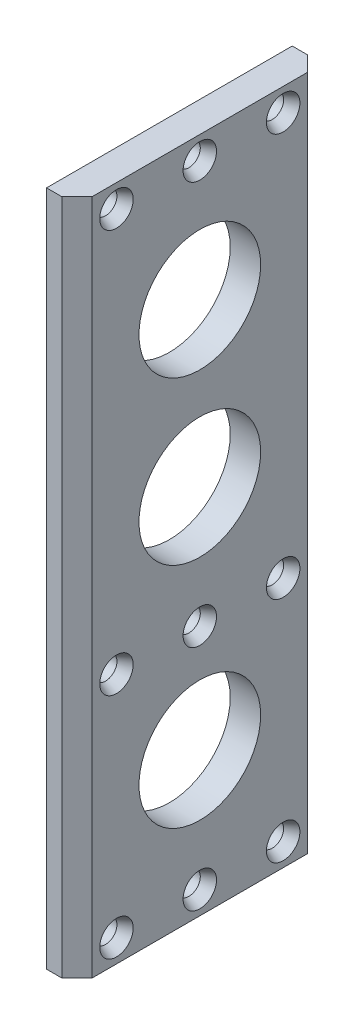
ISO-10303-21;
HEADER;
FILE_DESCRIPTION(('STEP AP214'),'2;1');
FILE_NAME('part.step','',(''),(''),'','','');
FILE_SCHEMA(('AUTOMOTIVE_DESIGN { 1 0 10303 214 1 1 1 1 }'));
ENDSEC;
DATA;
#1=APPLICATION_CONTEXT('core data for automotive mechanical design processes');
#2=APPLICATION_PROTOCOL_DEFINITION('international standard','automotive_design',2000,#1);
#3=PRODUCT_CONTEXT('',#1,'mechanical');
#4=PRODUCT('Part','Part','',(#3));
#5=PRODUCT_RELATED_PRODUCT_CATEGORY('part','',(#4));
#6=PRODUCT_DEFINITION_FORMATION('','',#4);
#7=PRODUCT_DEFINITION_CONTEXT('part definition',#1,'design');
#8=PRODUCT_DEFINITION('design','',#6,#7);
#9=PRODUCT_DEFINITION_SHAPE('','',#8);
#10=(LENGTH_UNIT() NAMED_UNIT(*) SI_UNIT(.MILLI.,.METRE.));
#11=(NAMED_UNIT(*) PLANE_ANGLE_UNIT() SI_UNIT($,.RADIAN.));
#12=(NAMED_UNIT(*) SI_UNIT($,.STERADIAN.) SOLID_ANGLE_UNIT());
#13=UNCERTAINTY_MEASURE_WITH_UNIT(LENGTH_MEASURE(1.E-05),#10,'distance_accuracy_value','');
#14=(GEOMETRIC_REPRESENTATION_CONTEXT(3) GLOBAL_UNCERTAINTY_ASSIGNED_CONTEXT((#13)) GLOBAL_UNIT_ASSIGNED_CONTEXT((#10,
#11,#12)) REPRESENTATION_CONTEXT('',''));
#15=CARTESIAN_POINT('',(0.,0.,0.));
#16=DIRECTION('',(0.,0.,1.));
#17=DIRECTION('',(1.,0.,0.));
#18=AXIS2_PLACEMENT_3D('',#15,#16,#17);
#19=CARTESIAN_POINT('',(4.,0.,-0.0251875597353166));
#20=DIRECTION('',(0.,0.,-1.));
#21=DIRECTION('',(-1.,0.,0.));
#22=AXIS2_PLACEMENT_3D('',#19,#20,#21);
#23=PLANE('',#22);
#24=DIRECTION('',(-1.,0.,0.));
#25=VECTOR('',#24,1.);
#26=CARTESIAN_POINT('',(4.,-89.,-0.0251875597353166));
#27=LINE('',#26,#25);
#28=CARTESIAN_POINT('',(2.,-89.,-0.0251875597353166));
#29=VERTEX_POINT('',#28);
#30=CARTESIAN_POINT('',(0.,-89.,-0.0251875597353166));
#31=VERTEX_POINT('',#30);
#32=EDGE_CURVE('E85',#29,#31,#27,.T.);
#33=ORIENTED_EDGE('',*,*,#32,.F.);
#34=DIRECTION('',(0.,1.,0.));
#35=VECTOR('',#34,1.);
#36=CARTESIAN_POINT('',(2.,0.,-0.0251875597353166));
#37=LINE('',#36,#35);
#38=CARTESIAN_POINT('',(2.,0.,-0.0251875597353166));
#39=VERTEX_POINT('',#38);
#40=EDGE_CURVE('E56',#29,#39,#37,.T.);
#41=ORIENTED_EDGE('',*,*,#40,.T.);
#42=DIRECTION('',(-1.,0.,0.));
#43=VECTOR('',#42,1.);
#44=CARTESIAN_POINT('',(4.,0.,-0.0251875597353166));
#45=LINE('',#44,#43);
#46=CARTESIAN_POINT('',(0.,0.,-0.0251875597353166));
#47=VERTEX_POINT('',#46);
#48=EDGE_CURVE('E105',#39,#47,#45,.T.);
#49=ORIENTED_EDGE('',*,*,#48,.T.);
#50=DIRECTION('',(0.,-1.,0.));
#51=VECTOR('',#50,1.);
#52=CARTESIAN_POINT('',(0.,0.,-0.0251875597353166));
#53=LINE('',#52,#51);
#54=EDGE_CURVE('E101',#47,#31,#53,.T.);
#55=ORIENTED_EDGE('',*,*,#54,.T.);
#56=EDGE_LOOP('',(#33,#41,#49,#55));
#57=FACE_BOUND('',#56,.T.);
#58=ADVANCED_FACE('F31',(#57),#23,.F.);
#59=CARTESIAN_POINT('',(4.,-89.,-0.0251875597353166));
#60=DIRECTION('',(0.,1.,0.));
#61=DIRECTION('',(0.,0.,1.));
#62=AXIS2_PLACEMENT_3D('',#59,#60,#61);
#63=PLANE('',#62);
#64=DIRECTION('',(0.,0.,-1.));
#65=VECTOR('',#64,1.);
#66=CARTESIAN_POINT('',(4.,-89.,-0.0251875597353166));
#67=LINE('',#66,#65);
#68=CARTESIAN_POINT('',(4.,-89.,-2.02518755973532));
#69=VERTEX_POINT('',#68);
#70=CARTESIAN_POINT('',(4.,-89.,-30.3385244395379));
#71=VERTEX_POINT('',#70);
#72=EDGE_CURVE('E119',#69,#71,#67,.T.);
#73=ORIENTED_EDGE('',*,*,#72,.F.);
#74=DIRECTION('',(-0.707106781186548,0.,0.707106781186548));
#75=VECTOR('',#74,1.);
#76=CARTESIAN_POINT('',(4.,-89.,-2.02518755973532));
#77=LINE('',#76,#75);
#78=EDGE_CURVE('E92',#69,#29,#77,.T.);
#79=ORIENTED_EDGE('',*,*,#78,.T.);
#80=ORIENTED_EDGE('',*,*,#32,.T.);
#81=DIRECTION('',(0.,0.,-1.));
#82=VECTOR('',#81,1.);
#83=CARTESIAN_POINT('',(0.,-89.,-0.0251875597353166));
#84=LINE('',#83,#82);
#85=CARTESIAN_POINT('',(0.,-89.,-32.3385244395379));
#86=VERTEX_POINT('',#85);
#87=EDGE_CURVE('E90',#31,#86,#84,.T.);
#88=ORIENTED_EDGE('',*,*,#87,.T.);
#89=DIRECTION('',(-1.,0.,0.));
#90=VECTOR('',#89,1.);
#91=CARTESIAN_POINT('',(4.,-89.,-32.3385244395379));
#92=LINE('',#91,#90);
#93=CARTESIAN_POINT('',(2.,-89.,-32.3385244395379));
#94=VERTEX_POINT('',#93);
#95=EDGE_CURVE('E95',#94,#86,#92,.T.);
#96=ORIENTED_EDGE('',*,*,#95,.F.);
#97=DIRECTION('',(0.707106781186548,0.,0.707106781186548));
#98=VECTOR('',#97,1.);
#99=CARTESIAN_POINT('',(4.,-89.,-30.3385244395379));
#100=LINE('',#99,#98);
#101=EDGE_CURVE('E129',#94,#71,#100,.T.);
#102=ORIENTED_EDGE('',*,*,#101,.T.);
#103=EDGE_LOOP('',(#73,#79,#80,#88,#96,#102));
#104=FACE_BOUND('',#103,.T.);
#105=ADVANCED_FACE('F88',(#104),#63,.F.);
#106=CARTESIAN_POINT('',(4.,0.,-32.3385244395379));
#107=DIRECTION('',(0.,0.,1.));
#108=DIRECTION('',(1.,0.,0.));
#109=AXIS2_PLACEMENT_3D('',#106,#107,#108);
#110=PLANE('',#109);
#111=DIRECTION('',(-1.,0.,0.));
#112=VECTOR('',#111,1.);
#113=CARTESIAN_POINT('',(4.,0.,-32.3385244395379));
#114=LINE('',#113,#112);
#115=CARTESIAN_POINT('',(2.,0.,-32.3385244395379));
#116=VERTEX_POINT('',#115);
#117=CARTESIAN_POINT('',(0.,0.,-32.3385244395379));
#118=VERTEX_POINT('',#117);
#119=EDGE_CURVE('E121',#116,#118,#114,.T.);
#120=ORIENTED_EDGE('',*,*,#119,.F.);
#121=DIRECTION('',(0.,-1.,0.));
#122=VECTOR('',#121,1.);
#123=CARTESIAN_POINT('',(2.,-89.,-32.3385244395379));
#124=LINE('',#123,#122);
#125=EDGE_CURVE('E11',#116,#94,#124,.T.);
#126=ORIENTED_EDGE('',*,*,#125,.T.);
#127=ORIENTED_EDGE('',*,*,#95,.T.);
#128=DIRECTION('',(0.,1.,0.));
#129=VECTOR('',#128,1.);
#130=CARTESIAN_POINT('',(0.,0.,-32.3385244395379));
#131=LINE('',#130,#129);
#132=EDGE_CURVE('E103',#86,#118,#131,.T.);
#133=ORIENTED_EDGE('',*,*,#132,.T.);
#134=EDGE_LOOP('',(#120,#126,#127,#133));
#135=FACE_BOUND('',#134,.T.);
#136=ADVANCED_FACE('F241',(#135),#110,.F.);
#137=CARTESIAN_POINT('',(4.,0.,-0.0251875597353166));
#138=DIRECTION('',(0.,-1.,0.));
#139=DIRECTION('',(0.,0.,-1.));
#140=AXIS2_PLACEMENT_3D('',#137,#138,#139);
#141=PLANE('',#140);
#142=ORIENTED_EDGE('',*,*,#48,.F.);
#143=DIRECTION('',(0.707106781186548,0.,-0.707106781186548));
#144=VECTOR('',#143,1.);
#145=CARTESIAN_POINT('',(4.,0.,-2.02518755973532));
#146=LINE('',#145,#144);
#147=CARTESIAN_POINT('',(4.,0.,-2.02518755973532));
#148=VERTEX_POINT('',#147);
#149=EDGE_CURVE('E40',#39,#148,#146,.T.);
#150=ORIENTED_EDGE('',*,*,#149,.T.);
#151=DIRECTION('',(0.,0.,1.));
#152=VECTOR('',#151,1.);
#153=CARTESIAN_POINT('',(4.,0.,-0.0251875597353166));
#154=LINE('',#153,#152);
#155=CARTESIAN_POINT('',(4.,0.,-30.3385244395379));
#156=VERTEX_POINT('',#155);
#157=EDGE_CURVE('E113',#156,#148,#154,.T.);
#158=ORIENTED_EDGE('',*,*,#157,.F.);
#159=DIRECTION('',(-0.707106781186548,0.,-0.707106781186548));
#160=VECTOR('',#159,1.);
#161=CARTESIAN_POINT('',(4.,0.,-30.3385244395379));
#162=LINE('',#161,#160);
#163=EDGE_CURVE('E48',#156,#116,#162,.T.);
#164=ORIENTED_EDGE('',*,*,#163,.T.);
#165=ORIENTED_EDGE('',*,*,#119,.T.);
#166=DIRECTION('',(0.,0.,1.));
#167=VECTOR('',#166,1.);
#168=CARTESIAN_POINT('',(0.,0.,-0.0251875597353166));
#169=LINE('',#168,#167);
#170=EDGE_CURVE('E117',#118,#47,#169,.T.);
#171=ORIENTED_EDGE('',*,*,#170,.T.);
#172=EDGE_LOOP('',(#142,#150,#158,#164,#165,#171));
#173=FACE_BOUND('',#172,.T.);
#174=ADVANCED_FACE('F238',(#173),#141,.F.);
#175=CARTESIAN_POINT('',(4.,-89.,-0.0251875597353166));
#176=DIRECTION('',(1.,0.,0.));
#177=DIRECTION('',(0.,0.,-1.));
#178=AXIS2_PLACEMENT_3D('',#175,#176,#177);
#179=PLANE('',#178);
#180=CARTESIAN_POINT('',(4.,-86.,-27.1440746600306));
#181=DIRECTION('',(1.,0.,0.));
#182=DIRECTION('',(0.,0.,-1.));
#183=AXIS2_PLACEMENT_3D('',#180,#181,#182);
#184=CIRCLE('',#183,2.2);
#185=CARTESIAN_POINT('',(4.,-86.,-29.3440746600306));
#186=VERTEX_POINT('',#185);
#187=EDGE_CURVE('E175',#186,#186,#184,.T.);
#188=ORIENTED_EDGE('',*,*,#187,.F.);
#189=EDGE_LOOP('',(#188));
#190=FACE_BOUND('',#189,.T.);
#191=CARTESIAN_POINT('',(4.,-85.9999999999786,-16.1818559996366));
#192=DIRECTION('',(1.,0.,0.));
#193=DIRECTION('',(0.,0.,-1.));
#194=AXIS2_PLACEMENT_3D('',#191,#192,#193);
#195=CIRCLE('',#194,2.2);
#196=CARTESIAN_POINT('',(4.,-85.9999999999786,-18.3818559996366));
#197=VERTEX_POINT('',#196);
#198=EDGE_CURVE('E165',#197,#197,#195,.T.);
#199=ORIENTED_EDGE('',*,*,#198,.F.);
#200=EDGE_LOOP('',(#199));
#201=FACE_BOUND('',#200,.T.);
#202=CARTESIAN_POINT('',(4.,-86.,-5.21963733924262));
#203=DIRECTION('',(1.,0.,0.));
#204=DIRECTION('',(0.,0.,-1.));
#205=AXIS2_PLACEMENT_3D('',#202,#203,#204);
#206=CIRCLE('',#205,2.2);
#207=CARTESIAN_POINT('',(4.,-86.,-7.41963733924262));
#208=VERTEX_POINT('',#207);
#209=EDGE_CURVE('E162',#208,#208,#206,.T.);
#210=ORIENTED_EDGE('',*,*,#209,.F.);
#211=EDGE_LOOP('',(#210));
#212=FACE_BOUND('',#211,.T.);
#213=CARTESIAN_POINT('',(4.,-56.0000000000058,-27.144074660037));
#214=DIRECTION('',(1.,0.,0.));
#215=DIRECTION('',(0.,0.,-1.));
#216=AXIS2_PLACEMENT_3D('',#213,#214,#215);
#217=CIRCLE('',#216,2.2);
#218=CARTESIAN_POINT('',(4.,-56.0000000000058,-29.344074660037));
#219=VERTEX_POINT('',#218);
#220=EDGE_CURVE('E159',#219,#219,#217,.T.);
#221=ORIENTED_EDGE('',*,*,#220,.F.);
#222=EDGE_LOOP('',(#221));
#223=FACE_BOUND('',#222,.T.);
#224=CARTESIAN_POINT('',(4.,-56.0000000000058,-16.1818559996366));
#225=DIRECTION('',(1.,0.,0.));
#226=DIRECTION('',(0.,0.,-1.));
#227=AXIS2_PLACEMENT_3D('',#224,#225,#226);
#228=CIRCLE('',#227,2.2);
#229=CARTESIAN_POINT('',(4.,-56.0000000000058,-18.3818559996366));
#230=VERTEX_POINT('',#229);
#231=EDGE_CURVE('E155',#230,#230,#228,.T.);
#232=ORIENTED_EDGE('',*,*,#231,.F.);
#233=EDGE_LOOP('',(#232));
#234=FACE_BOUND('',#233,.T.);
#235=CARTESIAN_POINT('',(4.,-56.0000000000058,-5.21963733924263));
#236=DIRECTION('',(1.,0.,0.));
#237=DIRECTION('',(0.,0.,-1.));
#238=AXIS2_PLACEMENT_3D('',#235,#236,#237);
#239=CIRCLE('',#238,2.2);
#240=CARTESIAN_POINT('',(4.,-56.0000000000058,-7.41963733924262));
#241=VERTEX_POINT('',#240);
#242=EDGE_CURVE('E151',#241,#241,#239,.T.);
#243=ORIENTED_EDGE('',*,*,#242,.F.);
#244=EDGE_LOOP('',(#243));
#245=FACE_BOUND('',#244,.T.);
#246=CARTESIAN_POINT('',(4.,-3.00000000000001,-27.1440746600306));
#247=DIRECTION('',(1.,0.,0.));
#248=DIRECTION('',(0.,0.,-1.));
#249=AXIS2_PLACEMENT_3D('',#246,#247,#248);
#250=CIRCLE('',#249,2.2);
#251=CARTESIAN_POINT('',(4.,-3.00000000000001,-29.3440746600306));
#252=VERTEX_POINT('',#251);
#253=EDGE_CURVE('E147',#252,#252,#250,.T.);
#254=ORIENTED_EDGE('',*,*,#253,.F.);
#255=EDGE_LOOP('',(#254));
#256=FACE_BOUND('',#255,.T.);
#257=CARTESIAN_POINT('',(4.,-3.00000000002138,-16.1818559996366));
#258=DIRECTION('',(1.,0.,0.));
#259=DIRECTION('',(0.,0.,-1.));
#260=AXIS2_PLACEMENT_3D('',#257,#258,#259);
#261=CIRCLE('',#260,2.2);
#262=CARTESIAN_POINT('',(4.,-3.00000000002138,-18.3818559996366));
#263=VERTEX_POINT('',#262);
#264=EDGE_CURVE('E143',#263,#263,#261,.T.);
#265=ORIENTED_EDGE('',*,*,#264,.F.);
#266=EDGE_LOOP('',(#265));
#267=FACE_BOUND('',#266,.T.);
#268=CARTESIAN_POINT('',(4.,-3.00000000000001,-5.21963733924262));
#269=DIRECTION('',(1.,0.,0.));
#270=DIRECTION('',(0.,0.,-1.));
#271=AXIS2_PLACEMENT_3D('',#268,#269,#270);
#272=CIRCLE('',#271,2.2);
#273=CARTESIAN_POINT('',(4.,-3.00000000000001,-7.41963733924262));
#274=VERTEX_POINT('',#273);
#275=EDGE_CURVE('E139',#274,#274,#272,.T.);
#276=ORIENTED_EDGE('',*,*,#275,.F.);
#277=EDGE_LOOP('',(#276));
#278=FACE_BOUND('',#277,.T.);
#279=CARTESIAN_POINT('',(4.,-70.1168907112617,-16.1818559996366));
#280=DIRECTION('',(1.,0.,0.));
#281=DIRECTION('',(0.,0.,-1.));
#282=AXIS2_PLACEMENT_3D('',#279,#280,#281);
#283=CIRCLE('',#282,8.);
#284=CARTESIAN_POINT('',(4.,-70.1168907112617,-24.1818559996366));
#285=VERTEX_POINT('',#284);
#286=EDGE_CURVE('E138',#285,#285,#283,.T.);
#287=ORIENTED_EDGE('',*,*,#286,.F.);
#288=EDGE_LOOP('',(#287));
#289=FACE_BOUND('',#288,.T.);
#290=CARTESIAN_POINT('',(4.,-40.1498763517338,-16.1818559996366));
#291=DIRECTION('',(1.,0.,0.));
#292=DIRECTION('',(0.,0.,-1.));
#293=AXIS2_PLACEMENT_3D('',#290,#291,#292);
#294=CIRCLE('',#293,8.);
#295=CARTESIAN_POINT('',(4.,-40.1498763517338,-24.1818559996366));
#296=VERTEX_POINT('',#295);
#297=EDGE_CURVE('E193',#296,#296,#294,.T.);
#298=ORIENTED_EDGE('',*,*,#297,.F.);
#299=EDGE_LOOP('',(#298));
#300=FACE_BOUND('',#299,.T.);
#301=CARTESIAN_POINT('',(4.,-18.8146650414183,-16.1818559996366));
#302=DIRECTION('',(1.,0.,0.));
#303=DIRECTION('',(0.,0.,-1.));
#304=AXIS2_PLACEMENT_3D('',#301,#302,#303);
#305=CIRCLE('',#304,8.);
#306=CARTESIAN_POINT('',(4.,-18.8146650414183,-24.1818559996366));
#307=VERTEX_POINT('',#306);
#308=EDGE_CURVE('E199',#307,#307,#305,.T.);
#309=ORIENTED_EDGE('',*,*,#308,.F.);
#310=EDGE_LOOP('',(#309));
#311=FACE_BOUND('',#310,.T.);
#312=ORIENTED_EDGE('',*,*,#157,.T.);
#313=DIRECTION('',(0.,-1.,0.));
#314=VECTOR('',#313,1.);
#315=CARTESIAN_POINT('',(4.,-89.,-2.02518755973532));
#316=LINE('',#315,#314);
#317=EDGE_CURVE('E126',#148,#69,#316,.T.);
#318=ORIENTED_EDGE('',*,*,#317,.T.);
#319=ORIENTED_EDGE('',*,*,#72,.T.);
#320=DIRECTION('',(0.,1.,0.));
#321=VECTOR('',#320,1.);
#322=CARTESIAN_POINT('',(4.,0.,-30.3385244395379));
#323=LINE('',#322,#321);
#324=EDGE_CURVE('E94',#71,#156,#323,.T.);
#325=ORIENTED_EDGE('',*,*,#324,.T.);
#326=EDGE_LOOP('',(#312,#318,#319,#325));
#327=FACE_BOUND('',#326,.T.);
#328=ADVANCED_FACE('F234',(#190,#201,#212,#223,#234,#245,#256,#267,#278,#289,#300,#311,#327),
#179,.T.);
#329=CARTESIAN_POINT('',(0.,-89.,-0.0251875597353166));
#330=DIRECTION('',(1.,0.,0.));
#331=DIRECTION('',(0.,0.,-1.));
#332=AXIS2_PLACEMENT_3D('',#329,#330,#331);
#333=PLANE('',#332);
#334=CARTESIAN_POINT('',(0.,-70.1168907112617,-16.1818559996366));
#335=DIRECTION('',(1.,0.,0.));
#336=DIRECTION('',(0.,0.,-1.));
#337=AXIS2_PLACEMENT_3D('',#334,#335,#336);
#338=CIRCLE('',#337,8.);
#339=CARTESIAN_POINT('',(0.,-70.1168907112617,-24.1818559996366));
#340=VERTEX_POINT('',#339);
#341=EDGE_CURVE('E190',#340,#340,#338,.T.);
#342=ORIENTED_EDGE('',*,*,#341,.T.);
#343=EDGE_LOOP('',(#342));
#344=FACE_BOUND('',#343,.T.);
#345=CARTESIAN_POINT('',(0.,-40.1498763517338,-16.1818559996366));
#346=DIRECTION('',(1.,0.,0.));
#347=DIRECTION('',(0.,0.,-1.));
#348=AXIS2_PLACEMENT_3D('',#345,#346,#347);
#349=CIRCLE('',#348,8.);
#350=CARTESIAN_POINT('',(0.,-40.1498763517338,-24.1818559996366));
#351=VERTEX_POINT('',#350);
#352=EDGE_CURVE('E196',#351,#351,#349,.T.);
#353=ORIENTED_EDGE('',*,*,#352,.T.);
#354=EDGE_LOOP('',(#353));
#355=FACE_BOUND('',#354,.T.);
#356=CARTESIAN_POINT('',(0.,-18.8146650414183,-16.1818559996366));
#357=DIRECTION('',(1.,0.,0.));
#358=DIRECTION('',(0.,0.,-1.));
#359=AXIS2_PLACEMENT_3D('',#356,#357,#358);
#360=CIRCLE('',#359,8.);
#361=CARTESIAN_POINT('',(0.,-18.8146650414183,-24.1818559996366));
#362=VERTEX_POINT('',#361);
#363=EDGE_CURVE('E202',#362,#362,#360,.T.);
#364=ORIENTED_EDGE('',*,*,#363,.T.);
#365=EDGE_LOOP('',(#364));
#366=FACE_BOUND('',#365,.T.);
#367=CARTESIAN_POINT('',(0.,-56.0000000000058,-27.144074660037));
#368=DIRECTION('',(1.,0.,0.));
#369=DIRECTION('',(0.,0.,-1.));
#370=AXIS2_PLACEMENT_3D('',#367,#368,#369);
#371=CIRCLE('',#370,1.5);
#372=CARTESIAN_POINT('',(0.,-56.0000000000058,-28.644074660037));
#373=VERTEX_POINT('',#372);
#374=EDGE_CURVE('E205',#373,#373,#371,.T.);
#375=ORIENTED_EDGE('',*,*,#374,.T.);
#376=EDGE_LOOP('',(#375));
#377=FACE_BOUND('',#376,.T.);
#378=CARTESIAN_POINT('',(0.,-56.0000000000058,-16.1818559996366));
#379=DIRECTION('',(1.,0.,0.));
#380=DIRECTION('',(0.,0.,-1.));
#381=AXIS2_PLACEMENT_3D('',#378,#379,#380);
#382=CIRCLE('',#381,1.5);
#383=CARTESIAN_POINT('',(0.,-56.0000000000058,-17.6818559996366));
#384=VERTEX_POINT('',#383);
#385=EDGE_CURVE('E210',#384,#384,#382,.T.);
#386=ORIENTED_EDGE('',*,*,#385,.T.);
#387=EDGE_LOOP('',(#386));
#388=FACE_BOUND('',#387,.T.);
#389=CARTESIAN_POINT('',(0.,-56.0000000000058,-5.21963733924263));
#390=DIRECTION('',(1.,0.,0.));
#391=DIRECTION('',(0.,0.,-1.));
#392=AXIS2_PLACEMENT_3D('',#389,#390,#391);
#393=CIRCLE('',#392,1.5);
#394=CARTESIAN_POINT('',(0.,-56.0000000000058,-6.71963733924263));
#395=VERTEX_POINT('',#394);
#396=EDGE_CURVE('E213',#395,#395,#393,.T.);
#397=ORIENTED_EDGE('',*,*,#396,.T.);
#398=EDGE_LOOP('',(#397));
#399=FACE_BOUND('',#398,.T.);
#400=CARTESIAN_POINT('',(0.,-86.,-5.21963733924262));
#401=DIRECTION('',(1.,0.,0.));
#402=DIRECTION('',(0.,0.,1.));
#403=AXIS2_PLACEMENT_3D('',#400,#401,#402);
#404=CIRCLE('',#403,1.5);
#405=CARTESIAN_POINT('',(0.,-86.,-3.71963733924262));
#406=VERTEX_POINT('',#405);
#407=EDGE_CURVE('E216',#406,#406,#404,.T.);
#408=ORIENTED_EDGE('',*,*,#407,.T.);
#409=EDGE_LOOP('',(#408));
#410=FACE_BOUND('',#409,.T.);
#411=CARTESIAN_POINT('',(0.,-85.9999999999786,-16.1818559996366));
#412=DIRECTION('',(1.,0.,0.));
#413=DIRECTION('',(0.,0.,1.));
#414=AXIS2_PLACEMENT_3D('',#411,#412,#413);
#415=CIRCLE('',#414,1.5);
#416=CARTESIAN_POINT('',(0.,-85.9999999999786,-14.6818559996366));
#417=VERTEX_POINT('',#416);
#418=EDGE_CURVE('E219',#417,#417,#415,.T.);
#419=ORIENTED_EDGE('',*,*,#418,.T.);
#420=EDGE_LOOP('',(#419));
#421=FACE_BOUND('',#420,.T.);
#422=CARTESIAN_POINT('',(0.,-86.,-27.1440746600306));
#423=DIRECTION('',(1.,0.,0.));
#424=DIRECTION('',(0.,0.,-1.));
#425=AXIS2_PLACEMENT_3D('',#422,#423,#424);
#426=CIRCLE('',#425,1.5);
#427=CARTESIAN_POINT('',(0.,-86.,-28.6440746600306));
#428=VERTEX_POINT('',#427);
#429=EDGE_CURVE('E222',#428,#428,#426,.T.);
#430=ORIENTED_EDGE('',*,*,#429,.T.);
#431=EDGE_LOOP('',(#430));
#432=FACE_BOUND('',#431,.T.);
#433=CARTESIAN_POINT('',(0.,-3.00000000002138,-16.1818559996366));
#434=DIRECTION('',(1.,0.,0.));
#435=DIRECTION('',(0.,0.,-1.));
#436=AXIS2_PLACEMENT_3D('',#433,#434,#435);
#437=CIRCLE('',#436,1.5);
#438=CARTESIAN_POINT('',(0.,-3.00000000002138,-17.6818559996366));
#439=VERTEX_POINT('',#438);
#440=EDGE_CURVE('E225',#439,#439,#437,.T.);
#441=ORIENTED_EDGE('',*,*,#440,.T.);
#442=EDGE_LOOP('',(#441));
#443=FACE_BOUND('',#442,.T.);
#444=CARTESIAN_POINT('',(0.,-3.00000000000001,-27.1440746600306));
#445=DIRECTION('',(1.,0.,0.));
#446=DIRECTION('',(0.,0.,1.));
#447=AXIS2_PLACEMENT_3D('',#444,#445,#446);
#448=CIRCLE('',#447,1.5);
#449=CARTESIAN_POINT('',(0.,-3.00000000000001,-25.6440746600306));
#450=VERTEX_POINT('',#449);
#451=EDGE_CURVE('E110',#450,#450,#448,.T.);
#452=ORIENTED_EDGE('',*,*,#451,.T.);
#453=EDGE_LOOP('',(#452));
#454=FACE_BOUND('',#453,.T.);
#455=CARTESIAN_POINT('',(0.,-3.00000000000001,-5.21963733924262));
#456=DIRECTION('',(1.,0.,0.));
#457=DIRECTION('',(0.,0.,-1.));
#458=AXIS2_PLACEMENT_3D('',#455,#456,#457);
#459=CIRCLE('',#458,1.5);
#460=CARTESIAN_POINT('',(0.,-3.00000000000001,-6.71963733924262));
#461=VERTEX_POINT('',#460);
#462=EDGE_CURVE('E107',#461,#461,#459,.T.);
#463=ORIENTED_EDGE('',*,*,#462,.T.);
#464=EDGE_LOOP('',(#463));
#465=FACE_BOUND('',#464,.T.);
#466=ORIENTED_EDGE('',*,*,#54,.F.);
#467=ORIENTED_EDGE('',*,*,#170,.F.);
#468=ORIENTED_EDGE('',*,*,#132,.F.);
#469=ORIENTED_EDGE('',*,*,#87,.F.);
#470=EDGE_LOOP('',(#466,#467,#468,#469));
#471=FACE_BOUND('',#470,.T.);
#472=ADVANCED_FACE('F99',(#344,#355,#366,#377,#388,#399,#410,#421,#432,#443,#454,#465,#471),
#333,.F.);
#473=CARTESIAN_POINT('',(0.,-3.00000000000001,-5.21963733924262));
#474=DIRECTION('',(1.,0.,0.));
#475=DIRECTION('',(0.,0.,-1.));
#476=AXIS2_PLACEMENT_3D('',#473,#474,#475);
#477=CYLINDRICAL_SURFACE('',#476,1.5);
#478=CARTESIAN_POINT('',(2.56478731089449,-3.00000000000001,-5.21963733924262));
#479=DIRECTION('',(1.,0.,0.));
#480=DIRECTION('',(0.,0.,-1.));
#481=AXIS2_PLACEMENT_3D('',#478,#479,#480);
#482=CIRCLE('',#481,1.5);
#483=CARTESIAN_POINT('',(2.56478731089449,-3.00000000000001,-6.71963733924262));
#484=VERTEX_POINT('',#483);
#485=EDGE_CURVE('E135',#484,#484,#482,.T.);
#486=ORIENTED_EDGE('',*,*,#485,.T.);
#487=EDGE_LOOP('',(#486));
#488=FACE_BOUND('',#487,.T.);
#489=ORIENTED_EDGE('',*,*,#462,.F.);
#490=EDGE_LOOP('',(#489));
#491=FACE_BOUND('',#490,.T.);
#492=ADVANCED_FACE('F268',(#488,#491),#477,.F.);
#493=CARTESIAN_POINT('',(0.,-3.00000000000001,-27.1440746600306));
#494=DIRECTION('',(1.,0.,0.));
#495=DIRECTION('',(0.,0.,-1.));
#496=AXIS2_PLACEMENT_3D('',#493,#494,#495);
#497=CYLINDRICAL_SURFACE('',#496,1.5);
#498=CARTESIAN_POINT('',(2.56478731089449,-3.00000000000001,-27.1440746600306));
#499=DIRECTION('',(1.,0.,0.));
#500=DIRECTION('',(0.,0.,-1.));
#501=AXIS2_PLACEMENT_3D('',#498,#499,#500);
#502=CIRCLE('',#501,1.5);
#503=CARTESIAN_POINT('',(2.56478731089449,-3.00000000000001,-28.6440746600306));
#504=VERTEX_POINT('',#503);
#505=EDGE_CURVE('E144',#504,#504,#502,.T.);
#506=ORIENTED_EDGE('',*,*,#505,.T.);
#507=EDGE_LOOP('',(#506));
#508=FACE_BOUND('',#507,.T.);
#509=ORIENTED_EDGE('',*,*,#451,.F.);
#510=EDGE_LOOP('',(#509));
#511=FACE_BOUND('',#510,.T.);
#512=ADVANCED_FACE('F275',(#508,#511),#497,.F.);
#513=CARTESIAN_POINT('',(0.,-3.00000000002138,-16.1818559996366));
#514=DIRECTION('',(1.,0.,0.));
#515=DIRECTION('',(0.,0.,-1.));
#516=AXIS2_PLACEMENT_3D('',#513,#514,#515);
#517=CYLINDRICAL_SURFACE('',#516,1.5);
#518=CARTESIAN_POINT('',(2.56478731089449,-3.00000000002138,-16.1818559996366));
#519=DIRECTION('',(1.,0.,0.));
#520=DIRECTION('',(0.,0.,-1.));
#521=AXIS2_PLACEMENT_3D('',#518,#519,#520);
#522=CIRCLE('',#521,1.5);
#523=CARTESIAN_POINT('',(2.56478731089449,-3.00000000002138,-17.6818559996366));
#524=VERTEX_POINT('',#523);
#525=EDGE_CURVE('E140',#524,#524,#522,.T.);
#526=ORIENTED_EDGE('',*,*,#525,.T.);
#527=EDGE_LOOP('',(#526));
#528=FACE_BOUND('',#527,.T.);
#529=ORIENTED_EDGE('',*,*,#440,.F.);
#530=EDGE_LOOP('',(#529));
#531=FACE_BOUND('',#530,.T.);
#532=ADVANCED_FACE('F279',(#528,#531),#517,.F.);
#533=CARTESIAN_POINT('',(0.,-86.,-27.1440746600306));
#534=DIRECTION('',(1.,0.,0.));
#535=DIRECTION('',(0.,0.,-1.));
#536=AXIS2_PLACEMENT_3D('',#533,#534,#535);
#537=CYLINDRICAL_SURFACE('',#536,1.5);
#538=CARTESIAN_POINT('',(2.56478731089449,-86.,-27.1440746600306));
#539=DIRECTION('',(1.,0.,0.));
#540=DIRECTION('',(0.,0.,-1.));
#541=AXIS2_PLACEMENT_3D('',#538,#539,#540);
#542=CIRCLE('',#541,1.5);
#543=CARTESIAN_POINT('',(2.56478731089449,-86.,-28.6440746600306));
#544=VERTEX_POINT('',#543);
#545=EDGE_CURVE('E35',#544,#544,#542,.T.);
#546=ORIENTED_EDGE('',*,*,#545,.T.);
#547=EDGE_LOOP('',(#546));
#548=FACE_BOUND('',#547,.T.);
#549=ORIENTED_EDGE('',*,*,#429,.F.);
#550=EDGE_LOOP('',(#549));
#551=FACE_BOUND('',#550,.T.);
#552=ADVANCED_FACE('F283',(#548,#551),#537,.F.);
#553=CARTESIAN_POINT('',(0.,-85.9999999999786,-16.1818559996366));
#554=DIRECTION('',(1.,0.,0.));
#555=DIRECTION('',(0.,0.,-1.));
#556=AXIS2_PLACEMENT_3D('',#553,#554,#555);
#557=CYLINDRICAL_SURFACE('',#556,1.5);
#558=CARTESIAN_POINT('',(2.5647873108945,-85.9999999999786,-16.1818559996366));
#559=DIRECTION('',(1.,0.,0.));
#560=DIRECTION('',(0.,0.,-1.));
#561=AXIS2_PLACEMENT_3D('',#558,#559,#560);
#562=CIRCLE('',#561,1.5);
#563=CARTESIAN_POINT('',(2.5647873108945,-85.9999999999786,-17.6818559996366));
#564=VERTEX_POINT('',#563);
#565=EDGE_CURVE('E163',#564,#564,#562,.T.);
#566=ORIENTED_EDGE('',*,*,#565,.T.);
#567=EDGE_LOOP('',(#566));
#568=FACE_BOUND('',#567,.T.);
#569=ORIENTED_EDGE('',*,*,#418,.F.);
#570=EDGE_LOOP('',(#569));
#571=FACE_BOUND('',#570,.T.);
#572=ADVANCED_FACE('F287',(#568,#571),#557,.F.);
#573=CARTESIAN_POINT('',(0.,-86.,-5.21963733924262));
#574=DIRECTION('',(1.,0.,0.));
#575=DIRECTION('',(0.,0.,-1.));
#576=AXIS2_PLACEMENT_3D('',#573,#574,#575);
#577=CYLINDRICAL_SURFACE('',#576,1.5);
#578=CARTESIAN_POINT('',(2.56478731089449,-86.,-5.21963733924262));
#579=DIRECTION('',(1.,0.,0.));
#580=DIRECTION('',(0.,0.,-1.));
#581=AXIS2_PLACEMENT_3D('',#578,#579,#580);
#582=CIRCLE('',#581,1.5);
#583=CARTESIAN_POINT('',(2.56478731089449,-86.,-6.71963733924262));
#584=VERTEX_POINT('',#583);
#585=EDGE_CURVE('E160',#584,#584,#582,.T.);
#586=ORIENTED_EDGE('',*,*,#585,.T.);
#587=EDGE_LOOP('',(#586));
#588=FACE_BOUND('',#587,.T.);
#589=ORIENTED_EDGE('',*,*,#407,.F.);
#590=EDGE_LOOP('',(#589));
#591=FACE_BOUND('',#590,.T.);
#592=ADVANCED_FACE('F291',(#588,#591),#577,.F.);
#593=CARTESIAN_POINT('',(0.,-56.0000000000058,-5.21963733924263));
#594=DIRECTION('',(1.,0.,0.));
#595=DIRECTION('',(0.,0.,-1.));
#596=AXIS2_PLACEMENT_3D('',#593,#594,#595);
#597=CYLINDRICAL_SURFACE('',#596,1.5);
#598=CARTESIAN_POINT('',(2.5647873108945,-56.0000000000058,-5.21963733924263));
#599=DIRECTION('',(1.,0.,0.));
#600=DIRECTION('',(0.,0.,-1.));
#601=AXIS2_PLACEMENT_3D('',#598,#599,#600);
#602=CIRCLE('',#601,1.5);
#603=CARTESIAN_POINT('',(2.5647873108945,-56.0000000000058,-6.71963733924263));
#604=VERTEX_POINT('',#603);
#605=EDGE_CURVE('E148',#604,#604,#602,.T.);
#606=ORIENTED_EDGE('',*,*,#605,.T.);
#607=EDGE_LOOP('',(#606));
#608=FACE_BOUND('',#607,.T.);
#609=ORIENTED_EDGE('',*,*,#396,.F.);
#610=EDGE_LOOP('',(#609));
#611=FACE_BOUND('',#610,.T.);
#612=ADVANCED_FACE('F294',(#608,#611),#597,.F.);
#613=CARTESIAN_POINT('',(0.,-56.0000000000058,-16.1818559996366));
#614=DIRECTION('',(1.,0.,0.));
#615=DIRECTION('',(0.,0.,-1.));
#616=AXIS2_PLACEMENT_3D('',#613,#614,#615);
#617=CYLINDRICAL_SURFACE('',#616,1.5);
#618=CARTESIAN_POINT('',(2.56478731089449,-56.0000000000058,-16.1818559996366));
#619=DIRECTION('',(1.,0.,0.));
#620=DIRECTION('',(0.,0.,-1.));
#621=AXIS2_PLACEMENT_3D('',#618,#619,#620);
#622=CIRCLE('',#621,1.5);
#623=CARTESIAN_POINT('',(2.56478731089449,-56.0000000000058,-17.6818559996366));
#624=VERTEX_POINT('',#623);
#625=EDGE_CURVE('E152',#624,#624,#622,.T.);
#626=ORIENTED_EDGE('',*,*,#625,.T.);
#627=EDGE_LOOP('',(#626));
#628=FACE_BOUND('',#627,.T.);
#629=ORIENTED_EDGE('',*,*,#385,.F.);
#630=EDGE_LOOP('',(#629));
#631=FACE_BOUND('',#630,.T.);
#632=ADVANCED_FACE('F298',(#628,#631),#617,.F.);
#633=CARTESIAN_POINT('',(0.,-56.0000000000058,-27.144074660037));
#634=DIRECTION('',(1.,0.,0.));
#635=DIRECTION('',(0.,0.,-1.));
#636=AXIS2_PLACEMENT_3D('',#633,#634,#635);
#637=CYLINDRICAL_SURFACE('',#636,1.5);
#638=CARTESIAN_POINT('',(2.56478731089449,-56.0000000000058,-27.144074660037));
#639=DIRECTION('',(1.,0.,0.));
#640=DIRECTION('',(0.,0.,-1.));
#641=AXIS2_PLACEMENT_3D('',#638,#639,#640);
#642=CIRCLE('',#641,1.5);
#643=CARTESIAN_POINT('',(2.56478731089449,-56.0000000000058,-28.644074660037));
#644=VERTEX_POINT('',#643);
#645=EDGE_CURVE('E156',#644,#644,#642,.T.);
#646=ORIENTED_EDGE('',*,*,#645,.T.);
#647=EDGE_LOOP('',(#646));
#648=FACE_BOUND('',#647,.T.);
#649=ORIENTED_EDGE('',*,*,#374,.F.);
#650=EDGE_LOOP('',(#649));
#651=FACE_BOUND('',#650,.T.);
#652=ADVANCED_FACE('F302',(#648,#651),#637,.F.);
#653=CARTESIAN_POINT('',(0.,-18.8146650414183,-16.1818559996366));
#654=DIRECTION('',(1.,0.,0.));
#655=DIRECTION('',(0.,0.,-1.));
#656=AXIS2_PLACEMENT_3D('',#653,#654,#655);
#657=CYLINDRICAL_SURFACE('',#656,8.);
#658=ORIENTED_EDGE('',*,*,#363,.F.);
#659=EDGE_LOOP('',(#658));
#660=FACE_BOUND('',#659,.T.);
#661=ORIENTED_EDGE('',*,*,#308,.T.);
#662=EDGE_LOOP('',(#661));
#663=FACE_BOUND('',#662,.T.);
#664=ADVANCED_FACE('F306',(#660,#663),#657,.F.);
#665=CARTESIAN_POINT('',(0.,-40.1498763517338,-16.1818559996366));
#666=DIRECTION('',(1.,0.,0.));
#667=DIRECTION('',(0.,0.,-1.));
#668=AXIS2_PLACEMENT_3D('',#665,#666,#667);
#669=CYLINDRICAL_SURFACE('',#668,8.);
#670=ORIENTED_EDGE('',*,*,#352,.F.);
#671=EDGE_LOOP('',(#670));
#672=FACE_BOUND('',#671,.T.);
#673=ORIENTED_EDGE('',*,*,#297,.T.);
#674=EDGE_LOOP('',(#673));
#675=FACE_BOUND('',#674,.T.);
#676=ADVANCED_FACE('F310',(#672,#675),#669,.F.);
#677=CARTESIAN_POINT('',(0.,-70.1168907112617,-16.1818559996366));
#678=DIRECTION('',(1.,0.,0.));
#679=DIRECTION('',(0.,0.,-1.));
#680=AXIS2_PLACEMENT_3D('',#677,#678,#679);
#681=CYLINDRICAL_SURFACE('',#680,8.);
#682=ORIENTED_EDGE('',*,*,#341,.F.);
#683=EDGE_LOOP('',(#682));
#684=FACE_BOUND('',#683,.T.);
#685=ORIENTED_EDGE('',*,*,#286,.T.);
#686=EDGE_LOOP('',(#685));
#687=FACE_BOUND('',#686,.T.);
#688=ADVANCED_FACE('F253',(#684,#687),#681,.F.);
#689=CARTESIAN_POINT('',(4.,-89.,-2.02518755973532));
#690=DIRECTION('',(0.707106781186547,0.,0.707106781186547));
#691=DIRECTION('',(0.707106781186548,0.,-0.707106781186548));
#692=AXIS2_PLACEMENT_3D('',#689,#690,#691);
#693=PLANE('',#692);
#694=ORIENTED_EDGE('',*,*,#149,.F.);
#695=ORIENTED_EDGE('',*,*,#40,.F.);
#696=ORIENTED_EDGE('',*,*,#78,.F.);
#697=ORIENTED_EDGE('',*,*,#317,.F.);
#698=EDGE_LOOP('',(#694,#695,#696,#697));
#699=FACE_BOUND('',#698,.T.);
#700=ADVANCED_FACE('F237',(#699),#693,.T.);
#701=CARTESIAN_POINT('',(4.,-89.,-30.3385244395379));
#702=DIRECTION('',(0.707106781186547,0.,-0.707106781186547));
#703=DIRECTION('',(-0.707106781186548,0.,-0.707106781186548));
#704=AXIS2_PLACEMENT_3D('',#701,#702,#703);
#705=PLANE('',#704);
#706=ORIENTED_EDGE('',*,*,#101,.F.);
#707=ORIENTED_EDGE('',*,*,#125,.F.);
#708=ORIENTED_EDGE('',*,*,#163,.F.);
#709=ORIENTED_EDGE('',*,*,#324,.F.);
#710=EDGE_LOOP('',(#706,#707,#708,#709));
#711=FACE_BOUND('',#710,.T.);
#712=ADVANCED_FACE('F33',(#711),#705,.T.);
#713=CARTESIAN_POINT('',(4.,-3.00000000000001,-5.21963733924262));
#714=DIRECTION('',(1.,0.,0.));
#715=DIRECTION('',(0.,0.,-1.));
#716=AXIS2_PLACEMENT_3D('',#713,#714,#715);
#717=CONICAL_SURFACE('',#716,2.2,0.453785605518526);
#718=ORIENTED_EDGE('',*,*,#275,.T.);
#719=EDGE_LOOP('',(#718));
#720=FACE_BOUND('',#719,.T.);
#721=ORIENTED_EDGE('',*,*,#485,.F.);
#722=EDGE_LOOP('',(#721));
#723=FACE_BOUND('',#722,.T.);
#724=ADVANCED_FACE('F245',(#720,#723),#717,.F.);
#725=CARTESIAN_POINT('',(4.,-3.00000000002138,-16.1818559996366));
#726=DIRECTION('',(1.,0.,0.));
#727=DIRECTION('',(0.,0.,-1.));
#728=AXIS2_PLACEMENT_3D('',#725,#726,#727);
#729=CONICAL_SURFACE('',#728,2.2,0.453785605518526);
#730=ORIENTED_EDGE('',*,*,#264,.T.);
#731=EDGE_LOOP('',(#730));
#732=FACE_BOUND('',#731,.T.);
#733=ORIENTED_EDGE('',*,*,#525,.F.);
#734=EDGE_LOOP('',(#733));
#735=FACE_BOUND('',#734,.T.);
#736=ADVANCED_FACE('F250',(#732,#735),#729,.F.);
#737=CARTESIAN_POINT('',(4.,-3.00000000000001,-27.1440746600306));
#738=DIRECTION('',(1.,0.,0.));
#739=DIRECTION('',(0.,0.,-1.));
#740=AXIS2_PLACEMENT_3D('',#737,#738,#739);
#741=CONICAL_SURFACE('',#740,2.2,0.453785605518526);
#742=ORIENTED_EDGE('',*,*,#253,.T.);
#743=EDGE_LOOP('',(#742));
#744=FACE_BOUND('',#743,.T.);
#745=ORIENTED_EDGE('',*,*,#505,.F.);
#746=EDGE_LOOP('',(#745));
#747=FACE_BOUND('',#746,.T.);
#748=ADVANCED_FACE('F320',(#744,#747),#741,.F.);
#749=CARTESIAN_POINT('',(4.,-56.0000000000058,-5.21963733924263));
#750=DIRECTION('',(1.,0.,0.));
#751=DIRECTION('',(0.,0.,-1.));
#752=AXIS2_PLACEMENT_3D('',#749,#750,#751);
#753=CONICAL_SURFACE('',#752,2.2,0.453785605518526);
#754=ORIENTED_EDGE('',*,*,#242,.T.);
#755=EDGE_LOOP('',(#754));
#756=FACE_BOUND('',#755,.T.);
#757=ORIENTED_EDGE('',*,*,#605,.F.);
#758=EDGE_LOOP('',(#757));
#759=FACE_BOUND('',#758,.T.);
#760=ADVANCED_FACE('F324',(#756,#759),#753,.F.);
#761=CARTESIAN_POINT('',(4.,-56.0000000000058,-16.1818559996366));
#762=DIRECTION('',(1.,0.,0.));
#763=DIRECTION('',(0.,0.,-1.));
#764=AXIS2_PLACEMENT_3D('',#761,#762,#763);
#765=CONICAL_SURFACE('',#764,2.2,0.453785605518526);
#766=ORIENTED_EDGE('',*,*,#231,.T.);
#767=EDGE_LOOP('',(#766));
#768=FACE_BOUND('',#767,.T.);
#769=ORIENTED_EDGE('',*,*,#625,.F.);
#770=EDGE_LOOP('',(#769));
#771=FACE_BOUND('',#770,.T.);
#772=ADVANCED_FACE('F328',(#768,#771),#765,.F.);
#773=CARTESIAN_POINT('',(4.,-56.0000000000058,-27.144074660037));
#774=DIRECTION('',(1.,0.,0.));
#775=DIRECTION('',(0.,0.,-1.));
#776=AXIS2_PLACEMENT_3D('',#773,#774,#775);
#777=CONICAL_SURFACE('',#776,2.2,0.453785605518526);
#778=ORIENTED_EDGE('',*,*,#220,.T.);
#779=EDGE_LOOP('',(#778));
#780=FACE_BOUND('',#779,.T.);
#781=ORIENTED_EDGE('',*,*,#645,.F.);
#782=EDGE_LOOP('',(#781));
#783=FACE_BOUND('',#782,.T.);
#784=ADVANCED_FACE('F332',(#780,#783),#777,.F.);
#785=CARTESIAN_POINT('',(4.,-86.,-5.21963733924262));
#786=DIRECTION('',(1.,0.,0.));
#787=DIRECTION('',(0.,0.,-1.));
#788=AXIS2_PLACEMENT_3D('',#785,#786,#787);
#789=CONICAL_SURFACE('',#788,2.2,0.453785605518526);
#790=ORIENTED_EDGE('',*,*,#209,.T.);
#791=EDGE_LOOP('',(#790));
#792=FACE_BOUND('',#791,.T.);
#793=ORIENTED_EDGE('',*,*,#585,.F.);
#794=EDGE_LOOP('',(#793));
#795=FACE_BOUND('',#794,.T.);
#796=ADVANCED_FACE('F336',(#792,#795),#789,.F.);
#797=CARTESIAN_POINT('',(4.,-85.9999999999786,-16.1818559996366));
#798=DIRECTION('',(1.,0.,0.));
#799=DIRECTION('',(0.,0.,-1.));
#800=AXIS2_PLACEMENT_3D('',#797,#798,#799);
#801=CONICAL_SURFACE('',#800,2.2,0.453785605518526);
#802=ORIENTED_EDGE('',*,*,#198,.T.);
#803=EDGE_LOOP('',(#802));
#804=FACE_BOUND('',#803,.T.);
#805=ORIENTED_EDGE('',*,*,#565,.F.);
#806=EDGE_LOOP('',(#805));
#807=FACE_BOUND('',#806,.T.);
#808=ADVANCED_FACE('F340',(#804,#807),#801,.F.);
#809=CARTESIAN_POINT('',(4.,-86.,-27.1440746600306));
#810=DIRECTION('',(1.,0.,0.));
#811=DIRECTION('',(0.,0.,-1.));
#812=AXIS2_PLACEMENT_3D('',#809,#810,#811);
#813=CONICAL_SURFACE('',#812,2.2,0.453785605518526);
#814=ORIENTED_EDGE('',*,*,#187,.T.);
#815=EDGE_LOOP('',(#814));
#816=FACE_BOUND('',#815,.T.);
#817=ORIENTED_EDGE('',*,*,#545,.F.);
#818=EDGE_LOOP('',(#817));
#819=FACE_BOUND('',#818,.T.);
#820=ADVANCED_FACE('F344',(#816,#819),#813,.F.);
#821=CLOSED_SHELL('',(#58,#105,#136,#174,#328,#472,#492,#512,#532,#552,#572,#592,#612,#632,#652,
#664,#676,#688,#700,#712,#724,#736,#748,#760,#772,#784,#796,#808,#820));
#822=MANIFOLD_SOLID_BREP('B2',#821);
#823=ADVANCED_BREP_SHAPE_REPRESENTATION('',(#18,#822),#14);
#824=SHAPE_DEFINITION_REPRESENTATION(#9,#823);
ENDSEC;
END-ISO-10303-21;
